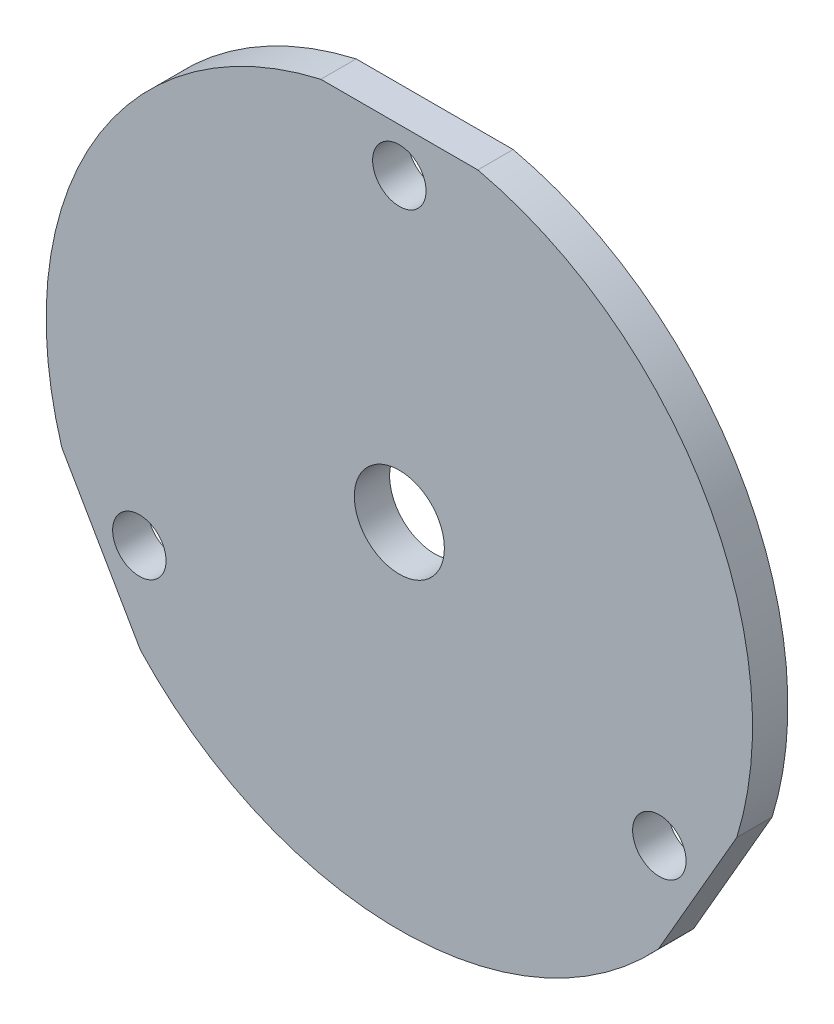
ISO-10303-21;
HEADER;
FILE_DESCRIPTION(('STEP AP214'),'2;1');
FILE_NAME('part.step','',(''),(''),'','','');
FILE_SCHEMA(('AUTOMOTIVE_DESIGN { 1 0 10303 214 1 1 1 1 }'));
ENDSEC;
DATA;
#1=APPLICATION_CONTEXT('core data for automotive mechanical design processes');
#2=APPLICATION_PROTOCOL_DEFINITION('international standard','automotive_design',2000,#1);
#3=PRODUCT_CONTEXT('',#1,'mechanical');
#4=PRODUCT('Part','Part','',(#3));
#5=PRODUCT_RELATED_PRODUCT_CATEGORY('part','',(#4));
#6=PRODUCT_DEFINITION_FORMATION('','',#4);
#7=PRODUCT_DEFINITION_CONTEXT('part definition',#1,'design');
#8=PRODUCT_DEFINITION('design','',#6,#7);
#9=PRODUCT_DEFINITION_SHAPE('','',#8);
#10=(LENGTH_UNIT() NAMED_UNIT(*) SI_UNIT(.MILLI.,.METRE.));
#11=(NAMED_UNIT(*) PLANE_ANGLE_UNIT() SI_UNIT($,.RADIAN.));
#12=(NAMED_UNIT(*) SI_UNIT($,.STERADIAN.) SOLID_ANGLE_UNIT());
#13=UNCERTAINTY_MEASURE_WITH_UNIT(LENGTH_MEASURE(1.E-05),#10,'distance_accuracy_value','');
#14=(GEOMETRIC_REPRESENTATION_CONTEXT(3) GLOBAL_UNCERTAINTY_ASSIGNED_CONTEXT((#13)) GLOBAL_UNIT_ASSIGNED_CONTEXT((#10,
#11,#12)) REPRESENTATION_CONTEXT('',''));
#15=CARTESIAN_POINT('',(0.,0.,0.));
#16=DIRECTION('',(0.,0.,1.));
#17=DIRECTION('',(1.,0.,0.));
#18=AXIS2_PLACEMENT_3D('',#15,#16,#17);
#19=CARTESIAN_POINT('',(0.,0.,4.5));
#20=DIRECTION('',(0.,0.,-1.));
#21=DIRECTION('',(-1.,0.,0.));
#22=AXIS2_PLACEMENT_3D('',#19,#20,#21);
#23=CYLINDRICAL_SURFACE('',#22,40.);
#24=CARTESIAN_POINT('',(0.,0.,4.5));
#25=DIRECTION('',(0.,0.,1.));
#26=DIRECTION('',(1.,0.,0.));
#27=AXIS2_PLACEMENT_3D('',#24,#25,#26);
#28=CIRCLE('',#27,40.);
#29=CARTESIAN_POINT('',(38.2190879562508,-11.8025978408299,4.5));
#30=VERTEX_POINT('',#29);
#31=CARTESIAN_POINT('',(8.88819441731556,39.,4.5));
#32=VERTEX_POINT('',#31);
#33=EDGE_CURVE('E117',#30,#32,#28,.T.);
#34=ORIENTED_EDGE('',*,*,#33,.F.);
#35=DIRECTION('',(0.,0.,1.));
#36=VECTOR('',#35,1.);
#37=CARTESIAN_POINT('',(38.2190879562508,-11.8025978408299,-1.5));
#38=LINE('',#37,#36);
#39=CARTESIAN_POINT('',(38.2190879562508,-11.8025978408299,0.5));
#40=VERTEX_POINT('',#39);
#41=EDGE_CURVE('E219',#40,#30,#38,.T.);
#42=ORIENTED_EDGE('',*,*,#41,.F.);
#43=CARTESIAN_POINT('',(0.,0.,0.5));
#44=DIRECTION('',(0.,0.,1.));
#45=DIRECTION('',(1.,0.,0.));
#46=AXIS2_PLACEMENT_3D('',#43,#44,#45);
#47=CIRCLE('',#46,40.);
#48=CARTESIAN_POINT('',(8.88819441731556,39.,0.5));
#49=VERTEX_POINT('',#48);
#50=EDGE_CURVE('E128',#40,#49,#47,.T.);
#51=ORIENTED_EDGE('',*,*,#50,.T.);
#52=DIRECTION('',(0.,0.,1.));
#53=VECTOR('',#52,1.);
#54=CARTESIAN_POINT('',(8.88819441731556,39.,-1.5));
#55=LINE('',#54,#53);
#56=EDGE_CURVE('E207',#49,#32,#55,.T.);
#57=ORIENTED_EDGE('',*,*,#56,.T.);
#58=EDGE_LOOP('',(#34,#42,#51,#57));
#59=FACE_BOUND('',#58,.T.);
#60=ADVANCED_FACE('F41',(#59),#23,.T.);
#61=CARTESIAN_POINT('',(-8.88819441731556,39.,4.5));
#62=VERTEX_POINT('',#61);
#63=CARTESIAN_POINT('',(-38.219087956251,-11.8025978408293,4.5));
#64=VERTEX_POINT('',#63);
#65=EDGE_CURVE('E114',#62,#64,#28,.T.);
#66=ORIENTED_EDGE('',*,*,#65,.F.);
#67=DIRECTION('',(0.,0.,1.));
#68=VECTOR('',#67,1.);
#69=CARTESIAN_POINT('',(-8.88819441731556,39.,-1.5));
#70=LINE('',#69,#68);
#71=CARTESIAN_POINT('',(-8.88819441731556,39.,0.5));
#72=VERTEX_POINT('',#71);
#73=EDGE_CURVE('E201',#72,#62,#70,.T.);
#74=ORIENTED_EDGE('',*,*,#73,.F.);
#75=CARTESIAN_POINT('',(-38.219087956251,-11.8025978408294,0.5));
#76=VERTEX_POINT('',#75);
#77=EDGE_CURVE('E123',#72,#76,#47,.T.);
#78=ORIENTED_EDGE('',*,*,#77,.T.);
#79=DIRECTION('',(0.,0.,1.));
#80=VECTOR('',#79,1.);
#81=CARTESIAN_POINT('',(-38.219087956251,-11.8025978408293,-1.5));
#82=LINE('',#81,#80);
#83=EDGE_CURVE('E65',#76,#64,#82,.T.);
#84=ORIENTED_EDGE('',*,*,#83,.T.);
#85=EDGE_LOOP('',(#66,#74,#78,#84));
#86=FACE_BOUND('',#85,.T.);
#87=ADVANCED_FACE('F165',(#86),#23,.T.);
#88=CARTESIAN_POINT('',(-29.3308935389356,-27.19740215917,0.5));
#89=VERTEX_POINT('',#88);
#90=CARTESIAN_POINT('',(29.3308935389352,-27.1974021591704,0.5));
#91=VERTEX_POINT('',#90);
#92=EDGE_CURVE('E131',#89,#91,#47,.T.);
#93=ORIENTED_EDGE('',*,*,#92,.T.);
#94=DIRECTION('',(0.,0.,1.));
#95=VECTOR('',#94,1.);
#96=CARTESIAN_POINT('',(29.3308935389352,-27.1974021591704,-1.5));
#97=LINE('',#96,#95);
#98=CARTESIAN_POINT('',(29.3308935389352,-27.1974021591704,4.5));
#99=VERTEX_POINT('',#98);
#100=EDGE_CURVE('E58',#91,#99,#97,.T.);
#101=ORIENTED_EDGE('',*,*,#100,.T.);
#102=CARTESIAN_POINT('',(-29.3308935389356,-27.19740215917,4.5));
#103=VERTEX_POINT('',#102);
#104=EDGE_CURVE('E111',#103,#99,#28,.T.);
#105=ORIENTED_EDGE('',*,*,#104,.F.);
#106=DIRECTION('',(0.,0.,1.));
#107=VECTOR('',#106,1.);
#108=CARTESIAN_POINT('',(-29.3308935389356,-27.19740215917,-1.5));
#109=LINE('',#108,#107);
#110=EDGE_CURVE('E95',#89,#103,#109,.T.);
#111=ORIENTED_EDGE('',*,*,#110,.F.);
#112=EDGE_LOOP('',(#93,#101,#105,#111));
#113=FACE_BOUND('',#112,.T.);
#114=ADVANCED_FACE('F43',(#113),#23,.T.);
#115=CARTESIAN_POINT('',(0.,0.,4.5));
#116=DIRECTION('',(0.,0.,1.));
#117=DIRECTION('',(1.,0.,0.));
#118=AXIS2_PLACEMENT_3D('',#115,#116,#117);
#119=PLANE('',#118);
#120=CARTESIAN_POINT('',(0.,0.,4.5));
#121=DIRECTION('',(0.,0.,1.));
#122=DIRECTION('',(1.,0.,0.));
#123=AXIS2_PLACEMENT_3D('',#120,#121,#122);
#124=CIRCLE('',#123,5.1);
#125=CARTESIAN_POINT('',(5.1,0.,4.5));
#126=VERTEX_POINT('',#125);
#127=EDGE_CURVE('E237',#126,#126,#124,.T.);
#128=ORIENTED_EDGE('',*,*,#127,.F.);
#129=EDGE_LOOP('',(#128));
#130=FACE_BOUND('',#129,.T.);
#131=CARTESIAN_POINT('',(-29.4448637286711,-16.9999999999997,4.5));
#132=DIRECTION('',(0.,0.,1.));
#133=DIRECTION('',(1.,0.,0.));
#134=AXIS2_PLACEMENT_3D('',#131,#132,#133);
#135=CIRCLE('',#134,3.025);
#136=CARTESIAN_POINT('',(-26.4198637286711,-16.9999999999997,4.5));
#137=VERTEX_POINT('',#136);
#138=EDGE_CURVE('E212',#137,#137,#135,.T.);
#139=ORIENTED_EDGE('',*,*,#138,.F.);
#140=EDGE_LOOP('',(#139));
#141=FACE_BOUND('',#140,.T.);
#142=DIRECTION('',(-0.500000000000004,-0.866025403784436,0.));
#143=VECTOR('',#142,1.);
#144=CARTESIAN_POINT('',(38.2190879562508,-11.8025978408299,4.5));
#145=LINE('',#144,#143);
#146=EDGE_CURVE('E214',#30,#99,#145,.T.);
#147=ORIENTED_EDGE('',*,*,#146,.F.);
#148=ORIENTED_EDGE('',*,*,#33,.T.);
#149=DIRECTION('',(1.,0.,0.));
#150=VECTOR('',#149,1.);
#151=CARTESIAN_POINT('',(-8.88819441731556,39.,4.5));
#152=LINE('',#151,#150);
#153=EDGE_CURVE('E202',#62,#32,#152,.T.);
#154=ORIENTED_EDGE('',*,*,#153,.F.);
#155=ORIENTED_EDGE('',*,*,#65,.T.);
#156=DIRECTION('',(-0.499999999999992,0.866025403784443,0.));
#157=VECTOR('',#156,1.);
#158=CARTESIAN_POINT('',(-29.3308935389356,-27.19740215917,4.5));
#159=LINE('',#158,#157);
#160=EDGE_CURVE('E98',#103,#64,#159,.T.);
#161=ORIENTED_EDGE('',*,*,#160,.F.);
#162=ORIENTED_EDGE('',*,*,#104,.T.);
#163=EDGE_LOOP('',(#147,#148,#154,#155,#161,#162));
#164=FACE_BOUND('',#163,.T.);
#165=CARTESIAN_POINT('',(29.4448637286708,-17.0000000000001,4.5));
#166=DIRECTION('',(0.,0.,1.));
#167=DIRECTION('',(1.,0.,0.));
#168=AXIS2_PLACEMENT_3D('',#165,#166,#167);
#169=CIRCLE('',#168,3.025);
#170=CARTESIAN_POINT('',(32.4698637286709,-17.0000000000001,4.5));
#171=VERTEX_POINT('',#170);
#172=EDGE_CURVE('E210',#171,#171,#169,.T.);
#173=ORIENTED_EDGE('',*,*,#172,.F.);
#174=EDGE_LOOP('',(#173));
#175=FACE_BOUND('',#174,.T.);
#176=CARTESIAN_POINT('',(0.,34.,4.5));
#177=DIRECTION('',(0.,0.,1.));
#178=DIRECTION('',(1.,0.,0.));
#179=AXIS2_PLACEMENT_3D('',#176,#177,#178);
#180=CIRCLE('',#179,3.025);
#181=CARTESIAN_POINT('',(3.025,34.,4.5));
#182=VERTEX_POINT('',#181);
#183=EDGE_CURVE('E126',#182,#182,#180,.T.);
#184=ORIENTED_EDGE('',*,*,#183,.F.);
#185=EDGE_LOOP('',(#184));
#186=FACE_BOUND('',#185,.T.);
#187=ADVANCED_FACE('F109',(#130,#141,#164,#175,#186),#119,.T.);
#188=CARTESIAN_POINT('',(0.,0.,0.5));
#189=DIRECTION('',(0.,0.,1.));
#190=DIRECTION('',(1.,0.,0.));
#191=AXIS2_PLACEMENT_3D('',#188,#189,#190);
#192=PLANE('',#191);
#193=CARTESIAN_POINT('',(0.,0.,0.5));
#194=DIRECTION('',(0.,0.,1.));
#195=DIRECTION('',(1.,0.,0.));
#196=AXIS2_PLACEMENT_3D('',#193,#194,#195);
#197=CIRCLE('',#196,5.1);
#198=CARTESIAN_POINT('',(5.1,0.,0.5));
#199=VERTEX_POINT('',#198);
#200=EDGE_CURVE('E45',#199,#199,#197,.T.);
#201=ORIENTED_EDGE('',*,*,#200,.T.);
#202=EDGE_LOOP('',(#201));
#203=FACE_BOUND('',#202,.T.);
#204=CARTESIAN_POINT('',(-29.4448637286711,-16.9999999999997,0.5));
#205=DIRECTION('',(0.,0.,1.));
#206=DIRECTION('',(1.,0.,0.));
#207=AXIS2_PLACEMENT_3D('',#204,#205,#206);
#208=CIRCLE('',#207,3.025);
#209=CARTESIAN_POINT('',(-26.4198637286711,-16.9999999999997,0.5));
#210=VERTEX_POINT('',#209);
#211=EDGE_CURVE('E132',#210,#210,#208,.T.);
#212=ORIENTED_EDGE('',*,*,#211,.T.);
#213=EDGE_LOOP('',(#212));
#214=FACE_BOUND('',#213,.T.);
#215=CARTESIAN_POINT('',(29.4448637286708,-17.0000000000001,0.5));
#216=DIRECTION('',(0.,0.,1.));
#217=DIRECTION('',(1.,0.,0.));
#218=AXIS2_PLACEMENT_3D('',#215,#216,#217);
#219=CIRCLE('',#218,3.025);
#220=CARTESIAN_POINT('',(32.4698637286709,-17.0000000000001,0.5));
#221=VERTEX_POINT('',#220);
#222=EDGE_CURVE('E136',#221,#221,#219,.T.);
#223=ORIENTED_EDGE('',*,*,#222,.T.);
#224=EDGE_LOOP('',(#223));
#225=FACE_BOUND('',#224,.T.);
#226=CARTESIAN_POINT('',(0.,34.,0.5));
#227=DIRECTION('',(0.,0.,1.));
#228=DIRECTION('',(1.,0.,0.));
#229=AXIS2_PLACEMENT_3D('',#226,#227,#228);
#230=CIRCLE('',#229,3.025);
#231=CARTESIAN_POINT('',(3.025,34.,0.5));
#232=VERTEX_POINT('',#231);
#233=EDGE_CURVE('E133',#232,#232,#230,.T.);
#234=ORIENTED_EDGE('',*,*,#233,.T.);
#235=EDGE_LOOP('',(#234));
#236=FACE_BOUND('',#235,.T.);
#237=ORIENTED_EDGE('',*,*,#50,.F.);
#238=DIRECTION('',(-0.500000000000004,-0.866025403784436,0.));
#239=VECTOR('',#238,1.);
#240=CARTESIAN_POINT('',(33.774990747593,-19.5000000000002,0.5));
#241=LINE('',#240,#239);
#242=EDGE_CURVE('E11',#40,#91,#241,.T.);
#243=ORIENTED_EDGE('',*,*,#242,.T.);
#244=ORIENTED_EDGE('',*,*,#92,.F.);
#245=DIRECTION('',(-0.499999999999992,0.866025403784443,0.));
#246=VECTOR('',#245,1.);
#247=CARTESIAN_POINT('',(-33.7749907475933,-19.4999999999997,0.5));
#248=LINE('',#247,#246);
#249=EDGE_CURVE('E99',#89,#76,#248,.T.);
#250=ORIENTED_EDGE('',*,*,#249,.T.);
#251=ORIENTED_EDGE('',*,*,#77,.F.);
#252=DIRECTION('',(1.,0.,0.));
#253=VECTOR('',#252,1.);
#254=CARTESIAN_POINT('',(0.,39.,0.5));
#255=LINE('',#254,#253);
#256=EDGE_CURVE('E50',#72,#49,#255,.T.);
#257=ORIENTED_EDGE('',*,*,#256,.T.);
#258=EDGE_LOOP('',(#237,#243,#244,#250,#251,#257));
#259=FACE_BOUND('',#258,.T.);
#260=ADVANCED_FACE('F145',(#203,#214,#225,#236,#259),#192,.F.);
#261=CARTESIAN_POINT('',(0.,34.,-1.5));
#262=DIRECTION('',(0.,0.,1.));
#263=DIRECTION('',(1.,0.,0.));
#264=AXIS2_PLACEMENT_3D('',#261,#262,#263);
#265=CYLINDRICAL_SURFACE('',#264,3.025);
#266=ORIENTED_EDGE('',*,*,#183,.T.);
#267=EDGE_LOOP('',(#266));
#268=FACE_BOUND('',#267,.T.);
#269=ORIENTED_EDGE('',*,*,#233,.F.);
#270=EDGE_LOOP('',(#269));
#271=FACE_BOUND('',#270,.T.);
#272=ADVANCED_FACE('F183',(#268,#271),#265,.F.);
#273=CARTESIAN_POINT('',(-29.3308935389356,-27.19740215917,-1.5));
#274=DIRECTION('',(0.866025403784443,0.499999999999992,0.));
#275=DIRECTION('',(-0.499999999999992,0.866025403784443,0.));
#276=AXIS2_PLACEMENT_3D('',#273,#274,#275);
#277=PLANE('',#276);
#278=ORIENTED_EDGE('',*,*,#110,.T.);
#279=ORIENTED_EDGE('',*,*,#160,.T.);
#280=ORIENTED_EDGE('',*,*,#83,.F.);
#281=ORIENTED_EDGE('',*,*,#249,.F.);
#282=EDGE_LOOP('',(#278,#279,#280,#281));
#283=FACE_BOUND('',#282,.T.);
#284=ADVANCED_FACE('F97',(#283),#277,.F.);
#285=CARTESIAN_POINT('',(-8.88819441731556,39.,-1.5));
#286=DIRECTION('',(0.,-1.,0.));
#287=DIRECTION('',(0.,0.,-1.));
#288=AXIS2_PLACEMENT_3D('',#285,#286,#287);
#289=PLANE('',#288);
#290=ORIENTED_EDGE('',*,*,#73,.T.);
#291=ORIENTED_EDGE('',*,*,#153,.T.);
#292=ORIENTED_EDGE('',*,*,#56,.F.);
#293=ORIENTED_EDGE('',*,*,#256,.F.);
#294=EDGE_LOOP('',(#290,#291,#292,#293));
#295=FACE_BOUND('',#294,.T.);
#296=ADVANCED_FACE('F192',(#295),#289,.F.);
#297=CARTESIAN_POINT('',(29.4448637286708,-17.0000000000001,-1.5));
#298=DIRECTION('',(0.,0.,1.));
#299=DIRECTION('',(1.,0.,0.));
#300=AXIS2_PLACEMENT_3D('',#297,#298,#299);
#301=CYLINDRICAL_SURFACE('',#300,3.025);
#302=ORIENTED_EDGE('',*,*,#172,.T.);
#303=EDGE_LOOP('',(#302));
#304=FACE_BOUND('',#303,.T.);
#305=ORIENTED_EDGE('',*,*,#222,.F.);
#306=EDGE_LOOP('',(#305));
#307=FACE_BOUND('',#306,.T.);
#308=ADVANCED_FACE('F160',(#304,#307),#301,.F.);
#309=CARTESIAN_POINT('',(38.2190879562508,-11.8025978408299,-1.5));
#310=DIRECTION('',(-0.866025403784436,0.500000000000004,0.));
#311=DIRECTION('',(-0.500000000000004,-0.866025403784436,0.));
#312=AXIS2_PLACEMENT_3D('',#309,#310,#311);
#313=PLANE('',#312);
#314=ORIENTED_EDGE('',*,*,#41,.T.);
#315=ORIENTED_EDGE('',*,*,#146,.T.);
#316=ORIENTED_EDGE('',*,*,#100,.F.);
#317=ORIENTED_EDGE('',*,*,#242,.F.);
#318=EDGE_LOOP('',(#314,#315,#316,#317));
#319=FACE_BOUND('',#318,.T.);
#320=ADVANCED_FACE('F151',(#319),#313,.F.);
#321=CARTESIAN_POINT('',(-29.4448637286711,-16.9999999999997,-1.5));
#322=DIRECTION('',(0.,0.,1.));
#323=DIRECTION('',(1.,0.,0.));
#324=AXIS2_PLACEMENT_3D('',#321,#322,#323);
#325=CYLINDRICAL_SURFACE('',#324,3.025);
#326=ORIENTED_EDGE('',*,*,#138,.T.);
#327=EDGE_LOOP('',(#326));
#328=FACE_BOUND('',#327,.T.);
#329=ORIENTED_EDGE('',*,*,#211,.F.);
#330=EDGE_LOOP('',(#329));
#331=FACE_BOUND('',#330,.T.);
#332=ADVANCED_FACE('F148',(#328,#331),#325,.F.);
#333=CARTESIAN_POINT('',(0.,0.,-10.5));
#334=DIRECTION('',(0.,0.,1.));
#335=DIRECTION('',(1.,0.,0.));
#336=AXIS2_PLACEMENT_3D('',#333,#334,#335);
#337=CYLINDRICAL_SURFACE('',#336,5.1);
#338=ORIENTED_EDGE('',*,*,#127,.T.);
#339=EDGE_LOOP('',(#338));
#340=FACE_BOUND('',#339,.T.);
#341=ORIENTED_EDGE('',*,*,#200,.F.);
#342=EDGE_LOOP('',(#341));
#343=FACE_BOUND('',#342,.T.);
#344=ADVANCED_FACE('F150',(#340,#343),#337,.F.);
#345=CLOSED_SHELL('',(#60,#87,#114,#187,#260,#272,#284,#296,#308,#320,#332,#344));
#346=MANIFOLD_SOLID_BREP('B2',#345);
#347=ADVANCED_BREP_SHAPE_REPRESENTATION('',(#18,#346),#14);
#348=SHAPE_DEFINITION_REPRESENTATION(#9,#347);
ENDSEC;
END-ISO-10303-21;
